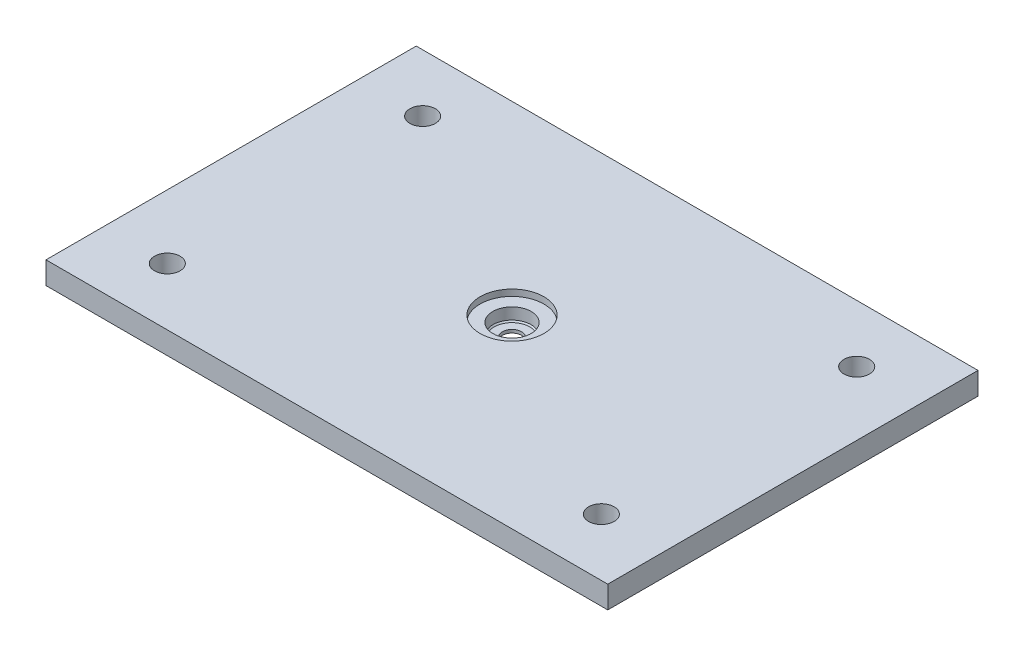
ISO-10303-21;
HEADER;
FILE_DESCRIPTION(('STEP AP214'),'2;1');
FILE_NAME('part.step','',(''),(''),'','','');
FILE_SCHEMA(('AUTOMOTIVE_DESIGN { 1 0 10303 214 1 1 1 1 }'));
ENDSEC;
DATA;
#1=APPLICATION_CONTEXT('core data for automotive mechanical design processes');
#2=APPLICATION_PROTOCOL_DEFINITION('international standard','automotive_design',2000,#1);
#3=PRODUCT_CONTEXT('',#1,'mechanical');
#4=PRODUCT('Part','Part','',(#3));
#5=PRODUCT_RELATED_PRODUCT_CATEGORY('part','',(#4));
#6=PRODUCT_DEFINITION_FORMATION('','',#4);
#7=PRODUCT_DEFINITION_CONTEXT('part definition',#1,'design');
#8=PRODUCT_DEFINITION('design','',#6,#7);
#9=PRODUCT_DEFINITION_SHAPE('','',#8);
#10=(LENGTH_UNIT() NAMED_UNIT(*) SI_UNIT(.MILLI.,.METRE.));
#11=(NAMED_UNIT(*) PLANE_ANGLE_UNIT() SI_UNIT($,.RADIAN.));
#12=(NAMED_UNIT(*) SI_UNIT($,.STERADIAN.) SOLID_ANGLE_UNIT());
#13=UNCERTAINTY_MEASURE_WITH_UNIT(LENGTH_MEASURE(1.E-05),#10,'distance_accuracy_value','');
#14=(GEOMETRIC_REPRESENTATION_CONTEXT(3) GLOBAL_UNCERTAINTY_ASSIGNED_CONTEXT((#13)) GLOBAL_UNIT_ASSIGNED_CONTEXT((#10,
#11,#12)) REPRESENTATION_CONTEXT('',''));
#15=CARTESIAN_POINT('',(0.,0.,0.));
#16=DIRECTION('',(0.,0.,1.));
#17=DIRECTION('',(1.,0.,0.));
#18=AXIS2_PLACEMENT_3D('',#15,#16,#17);
#19=CARTESIAN_POINT('',(440.,35.,-290.));
#20=DIRECTION('',(-1.,0.,0.));
#21=DIRECTION('',(0.,0.,1.));
#22=AXIS2_PLACEMENT_3D('',#19,#20,#21);
#23=PLANE('',#22);
#24=DIRECTION('',(0.,0.,-1.));
#25=VECTOR('',#24,1.);
#26=CARTESIAN_POINT('',(440.,0.,-290.));
#27=LINE('',#26,#25);
#28=CARTESIAN_POINT('',(440.,0.,290.));
#29=VERTEX_POINT('',#28);
#30=CARTESIAN_POINT('',(440.,0.,-290.));
#31=VERTEX_POINT('',#30);
#32=EDGE_CURVE('E103',#29,#31,#27,.T.);
#33=ORIENTED_EDGE('',*,*,#32,.T.);
#34=DIRECTION('',(0.,-1.,0.));
#35=VECTOR('',#34,1.);
#36=CARTESIAN_POINT('',(440.,35.,-290.));
#37=LINE('',#36,#35);
#38=CARTESIAN_POINT('',(440.,35.,-290.));
#39=VERTEX_POINT('',#38);
#40=EDGE_CURVE('E94',#39,#31,#37,.T.);
#41=ORIENTED_EDGE('',*,*,#40,.F.);
#42=DIRECTION('',(0.,0.,-1.));
#43=VECTOR('',#42,1.);
#44=CARTESIAN_POINT('',(440.,35.,-290.));
#45=LINE('',#44,#43);
#46=CARTESIAN_POINT('',(440.,35.,290.));
#47=VERTEX_POINT('',#46);
#48=EDGE_CURVE('E88',#47,#39,#45,.T.);
#49=ORIENTED_EDGE('',*,*,#48,.F.);
#50=DIRECTION('',(0.,-1.,0.));
#51=VECTOR('',#50,1.);
#52=CARTESIAN_POINT('',(440.,35.,290.));
#53=LINE('',#52,#51);
#54=EDGE_CURVE('E99',#47,#29,#53,.T.);
#55=ORIENTED_EDGE('',*,*,#54,.T.);
#56=EDGE_LOOP('',(#33,#41,#49,#55));
#57=FACE_BOUND('',#56,.T.);
#58=ADVANCED_FACE('F33',(#57),#23,.F.);
#59=CARTESIAN_POINT('',(-440.,35.,-290.));
#60=DIRECTION('',(0.,0.,1.));
#61=DIRECTION('',(1.,0.,0.));
#62=AXIS2_PLACEMENT_3D('',#59,#60,#61);
#63=PLANE('',#62);
#64=DIRECTION('',(-1.,0.,0.));
#65=VECTOR('',#64,1.);
#66=CARTESIAN_POINT('',(-440.,0.,-290.));
#67=LINE('',#66,#65);
#68=CARTESIAN_POINT('',(-440.,0.,-290.));
#69=VERTEX_POINT('',#68);
#70=EDGE_CURVE('E93',#31,#69,#67,.T.);
#71=ORIENTED_EDGE('',*,*,#70,.T.);
#72=DIRECTION('',(0.,-1.,0.));
#73=VECTOR('',#72,1.);
#74=CARTESIAN_POINT('',(-440.,35.,-290.));
#75=LINE('',#74,#73);
#76=CARTESIAN_POINT('',(-440.,35.,-290.));
#77=VERTEX_POINT('',#76);
#78=EDGE_CURVE('E91',#77,#69,#75,.T.);
#79=ORIENTED_EDGE('',*,*,#78,.F.);
#80=DIRECTION('',(-1.,0.,0.));
#81=VECTOR('',#80,1.);
#82=CARTESIAN_POINT('',(-440.,35.,-290.));
#83=LINE('',#82,#81);
#84=EDGE_CURVE('E83',#39,#77,#83,.T.);
#85=ORIENTED_EDGE('',*,*,#84,.F.);
#86=ORIENTED_EDGE('',*,*,#40,.T.);
#87=EDGE_LOOP('',(#71,#79,#85,#86));
#88=FACE_BOUND('',#87,.T.);
#89=ADVANCED_FACE('F92',(#88),#63,.F.);
#90=CARTESIAN_POINT('',(-440.,35.,-290.));
#91=DIRECTION('',(1.,0.,0.));
#92=DIRECTION('',(0.,0.,-1.));
#93=AXIS2_PLACEMENT_3D('',#90,#91,#92);
#94=PLANE('',#93);
#95=DIRECTION('',(0.,0.,1.));
#96=VECTOR('',#95,1.);
#97=CARTESIAN_POINT('',(-440.,0.,-290.));
#98=LINE('',#97,#96);
#99=CARTESIAN_POINT('',(-440.,0.,290.));
#100=VERTEX_POINT('',#99);
#101=EDGE_CURVE('E69',#69,#100,#98,.T.);
#102=ORIENTED_EDGE('',*,*,#101,.T.);
#103=DIRECTION('',(0.,-1.,0.));
#104=VECTOR('',#103,1.);
#105=CARTESIAN_POINT('',(-440.,35.,290.));
#106=LINE('',#105,#104);
#107=CARTESIAN_POINT('',(-440.,35.,290.));
#108=VERTEX_POINT('',#107);
#109=EDGE_CURVE('E95',#108,#100,#106,.T.);
#110=ORIENTED_EDGE('',*,*,#109,.F.);
#111=DIRECTION('',(0.,0.,1.));
#112=VECTOR('',#111,1.);
#113=CARTESIAN_POINT('',(-440.,35.,-290.));
#114=LINE('',#113,#112);
#115=EDGE_CURVE('E86',#77,#108,#114,.T.);
#116=ORIENTED_EDGE('',*,*,#115,.F.);
#117=ORIENTED_EDGE('',*,*,#78,.T.);
#118=EDGE_LOOP('',(#102,#110,#116,#117));
#119=FACE_BOUND('',#118,.T.);
#120=ADVANCED_FACE('F97',(#119),#94,.F.);
#121=CARTESIAN_POINT('',(-440.,35.,290.));
#122=DIRECTION('',(0.,0.,-1.));
#123=DIRECTION('',(-1.,0.,0.));
#124=AXIS2_PLACEMENT_3D('',#121,#122,#123);
#125=PLANE('',#124);
#126=DIRECTION('',(1.,0.,0.));
#127=VECTOR('',#126,1.);
#128=CARTESIAN_POINT('',(-440.,0.,290.));
#129=LINE('',#128,#127);
#130=EDGE_CURVE('E75',#100,#29,#129,.T.);
#131=ORIENTED_EDGE('',*,*,#130,.T.);
#132=ORIENTED_EDGE('',*,*,#54,.F.);
#133=DIRECTION('',(1.,0.,0.));
#134=VECTOR('',#133,1.);
#135=CARTESIAN_POINT('',(-440.,35.,290.));
#136=LINE('',#135,#134);
#137=EDGE_CURVE('E52',#108,#47,#136,.T.);
#138=ORIENTED_EDGE('',*,*,#137,.F.);
#139=ORIENTED_EDGE('',*,*,#109,.T.);
#140=EDGE_LOOP('',(#131,#132,#138,#139));
#141=FACE_BOUND('',#140,.T.);
#142=ADVANCED_FACE('F158',(#141),#125,.F.);
#143=CARTESIAN_POINT('',(0.,35.,0.));
#144=DIRECTION('',(0.,1.,0.));
#145=DIRECTION('',(0.,0.,1.));
#146=AXIS2_PLACEMENT_3D('',#143,#144,#145);
#147=PLANE('',#146);
#148=CARTESIAN_POINT('',(-340.,35.,200.));
#149=DIRECTION('',(0.,1.,0.));
#150=DIRECTION('',(0.,0.,-1.));
#151=AXIS2_PLACEMENT_3D('',#148,#149,#150);
#152=CIRCLE('',#151,20.);
#153=CARTESIAN_POINT('',(-340.,35.,180.));
#154=VERTEX_POINT('',#153);
#155=EDGE_CURVE('E135',#154,#154,#152,.T.);
#156=ORIENTED_EDGE('',*,*,#155,.F.);
#157=EDGE_LOOP('',(#156));
#158=FACE_BOUND('',#157,.T.);
#159=CARTESIAN_POINT('',(340.,35.,200.));
#160=DIRECTION('',(0.,1.,0.));
#161=DIRECTION('',(0.,0.,-1.));
#162=AXIS2_PLACEMENT_3D('',#159,#160,#161);
#163=CIRCLE('',#162,20.);
#164=CARTESIAN_POINT('',(340.,35.,180.));
#165=VERTEX_POINT('',#164);
#166=EDGE_CURVE('E125',#165,#165,#163,.T.);
#167=ORIENTED_EDGE('',*,*,#166,.F.);
#168=EDGE_LOOP('',(#167));
#169=FACE_BOUND('',#168,.T.);
#170=CARTESIAN_POINT('',(340.,35.,-200.));
#171=DIRECTION('',(0.,1.,0.));
#172=DIRECTION('',(0.,0.,1.));
#173=AXIS2_PLACEMENT_3D('',#170,#171,#172);
#174=CIRCLE('',#173,20.);
#175=CARTESIAN_POINT('',(340.,35.,-180.));
#176=VERTEX_POINT('',#175);
#177=EDGE_CURVE('E122',#176,#176,#174,.T.);
#178=ORIENTED_EDGE('',*,*,#177,.F.);
#179=EDGE_LOOP('',(#178));
#180=FACE_BOUND('',#179,.T.);
#181=CARTESIAN_POINT('',(-340.,35.,-200.));
#182=DIRECTION('',(0.,1.,0.));
#183=DIRECTION('',(0.,0.,1.));
#184=AXIS2_PLACEMENT_3D('',#181,#182,#183);
#185=CIRCLE('',#184,20.);
#186=CARTESIAN_POINT('',(-340.,35.,-180.));
#187=VERTEX_POINT('',#186);
#188=EDGE_CURVE('E119',#187,#187,#185,.T.);
#189=ORIENTED_EDGE('',*,*,#188,.F.);
#190=EDGE_LOOP('',(#189));
#191=FACE_BOUND('',#190,.T.);
#192=CARTESIAN_POINT('',(0.,35.,0.));
#193=DIRECTION('',(0.,1.,0.));
#194=DIRECTION('',(0.,0.,1.));
#195=AXIS2_PLACEMENT_3D('',#192,#193,#194);
#196=CIRCLE('',#195,50.);
#197=CARTESIAN_POINT('',(0.,35.,50.));
#198=VERTEX_POINT('',#197);
#199=EDGE_CURVE('E148',#198,#198,#196,.T.);
#200=ORIENTED_EDGE('',*,*,#199,.F.);
#201=EDGE_LOOP('',(#200));
#202=FACE_BOUND('',#201,.T.);
#203=ORIENTED_EDGE('',*,*,#48,.T.);
#204=ORIENTED_EDGE('',*,*,#84,.T.);
#205=ORIENTED_EDGE('',*,*,#115,.T.);
#206=ORIENTED_EDGE('',*,*,#137,.T.);
#207=EDGE_LOOP('',(#203,#204,#205,#206));
#208=FACE_BOUND('',#207,.T.);
#209=ADVANCED_FACE('F84',(#158,#169,#180,#191,#202,#208),#147,.T.);
#210=CARTESIAN_POINT('',(0.,0.,0.));
#211=DIRECTION('',(0.,1.,0.));
#212=DIRECTION('',(0.,0.,1.));
#213=AXIS2_PLACEMENT_3D('',#210,#211,#212);
#214=PLANE('',#213);
#215=CARTESIAN_POINT('',(-340.,0.,200.));
#216=DIRECTION('',(0.,1.,0.));
#217=DIRECTION('',(0.,0.,1.));
#218=AXIS2_PLACEMENT_3D('',#215,#216,#217);
#219=CIRCLE('',#218,20.);
#220=CARTESIAN_POINT('',(-340.,0.,220.));
#221=VERTEX_POINT('',#220);
#222=EDGE_CURVE('E37',#221,#221,#219,.T.);
#223=ORIENTED_EDGE('',*,*,#222,.T.);
#224=EDGE_LOOP('',(#223));
#225=FACE_BOUND('',#224,.T.);
#226=CARTESIAN_POINT('',(340.,0.,200.));
#227=DIRECTION('',(0.,1.,0.));
#228=DIRECTION('',(0.,0.,1.));
#229=AXIS2_PLACEMENT_3D('',#226,#227,#228);
#230=CIRCLE('',#229,20.);
#231=CARTESIAN_POINT('',(340.,0.,220.));
#232=VERTEX_POINT('',#231);
#233=EDGE_CURVE('E123',#232,#232,#230,.T.);
#234=ORIENTED_EDGE('',*,*,#233,.T.);
#235=EDGE_LOOP('',(#234));
#236=FACE_BOUND('',#235,.T.);
#237=CARTESIAN_POINT('',(340.,0.,-200.));
#238=DIRECTION('',(0.,1.,0.));
#239=DIRECTION('',(0.,0.,1.));
#240=AXIS2_PLACEMENT_3D('',#237,#238,#239);
#241=CIRCLE('',#240,20.);
#242=CARTESIAN_POINT('',(340.,0.,-180.));
#243=VERTEX_POINT('',#242);
#244=EDGE_CURVE('E120',#243,#243,#241,.T.);
#245=ORIENTED_EDGE('',*,*,#244,.T.);
#246=EDGE_LOOP('',(#245));
#247=FACE_BOUND('',#246,.T.);
#248=CARTESIAN_POINT('',(-340.,0.,-200.));
#249=DIRECTION('',(0.,1.,0.));
#250=DIRECTION('',(0.,0.,1.));
#251=AXIS2_PLACEMENT_3D('',#248,#249,#250);
#252=CIRCLE('',#251,20.);
#253=CARTESIAN_POINT('',(-340.,0.,-180.));
#254=VERTEX_POINT('',#253);
#255=EDGE_CURVE('E115',#254,#254,#252,.T.);
#256=ORIENTED_EDGE('',*,*,#255,.T.);
#257=EDGE_LOOP('',(#256));
#258=FACE_BOUND('',#257,.T.);
#259=CARTESIAN_POINT('',(0.,0.,0.));
#260=DIRECTION('',(0.,1.,0.));
#261=DIRECTION('',(0.,0.,1.));
#262=AXIS2_PLACEMENT_3D('',#259,#260,#261);
#263=CIRCLE('',#262,15.);
#264=CARTESIAN_POINT('',(0.,0.,15.));
#265=VERTEX_POINT('',#264);
#266=EDGE_CURVE('E142',#265,#265,#263,.T.);
#267=ORIENTED_EDGE('',*,*,#266,.T.);
#268=EDGE_LOOP('',(#267));
#269=FACE_BOUND('',#268,.T.);
#270=ORIENTED_EDGE('',*,*,#32,.F.);
#271=ORIENTED_EDGE('',*,*,#130,.F.);
#272=ORIENTED_EDGE('',*,*,#101,.F.);
#273=ORIENTED_EDGE('',*,*,#70,.F.);
#274=EDGE_LOOP('',(#270,#271,#272,#273));
#275=FACE_BOUND('',#274,.T.);
#276=ADVANCED_FACE('F157',(#225,#236,#247,#258,#269,#275),#214,.F.);
#277=CARTESIAN_POINT('',(0.,25.,0.));
#278=DIRECTION('',(0.,1.,0.));
#279=DIRECTION('',(0.,0.,1.));
#280=AXIS2_PLACEMENT_3D('',#277,#278,#279);
#281=CYLINDRICAL_SURFACE('',#280,50.);
#282=CARTESIAN_POINT('',(0.,25.,0.));
#283=DIRECTION('',(0.,1.,0.));
#284=DIRECTION('',(0.,0.,1.));
#285=AXIS2_PLACEMENT_3D('',#282,#283,#284);
#286=CIRCLE('',#285,50.);
#287=CARTESIAN_POINT('',(0.,25.,50.));
#288=VERTEX_POINT('',#287);
#289=EDGE_CURVE('E106',#288,#288,#286,.T.);
#290=ORIENTED_EDGE('',*,*,#289,.F.);
#291=EDGE_LOOP('',(#290));
#292=FACE_BOUND('',#291,.T.);
#293=ORIENTED_EDGE('',*,*,#199,.T.);
#294=EDGE_LOOP('',(#293));
#295=FACE_BOUND('',#294,.T.);
#296=ADVANCED_FACE('F154',(#292,#295),#281,.F.);
#297=CARTESIAN_POINT('',(0.,25.,0.));
#298=DIRECTION('',(0.,1.,0.));
#299=DIRECTION('',(0.,0.,1.));
#300=AXIS2_PLACEMENT_3D('',#297,#298,#299);
#301=PLANE('',#300);
#302=CARTESIAN_POINT('',(0.,25.,0.));
#303=DIRECTION('',(0.,1.,0.));
#304=DIRECTION('',(0.,0.,1.));
#305=AXIS2_PLACEMENT_3D('',#302,#303,#304);
#306=CIRCLE('',#305,30.);
#307=CARTESIAN_POINT('',(0.,25.,30.));
#308=VERTEX_POINT('',#307);
#309=EDGE_CURVE('E145',#308,#308,#306,.T.);
#310=ORIENTED_EDGE('',*,*,#309,.F.);
#311=EDGE_LOOP('',(#310));
#312=FACE_BOUND('',#311,.T.);
#313=ORIENTED_EDGE('',*,*,#289,.T.);
#314=EDGE_LOOP('',(#313));
#315=FACE_BOUND('',#314,.T.);
#316=ADVANCED_FACE('F206',(#312,#315),#301,.T.);
#317=CARTESIAN_POINT('',(0.,5.,0.));
#318=DIRECTION('',(0.,1.,0.));
#319=DIRECTION('',(0.,0.,1.));
#320=AXIS2_PLACEMENT_3D('',#317,#318,#319);
#321=CYLINDRICAL_SURFACE('',#320,30.);
#322=CARTESIAN_POINT('',(0.,7.00000000000033,0.));
#323=DIRECTION('',(0.,1.,0.));
#324=DIRECTION('',(0.,0.,1.));
#325=AXIS2_PLACEMENT_3D('',#322,#323,#324);
#326=CIRCLE('',#325,30.);
#327=CARTESIAN_POINT('',(0.,7.00000000000033,30.));
#328=VERTEX_POINT('',#327);
#329=EDGE_CURVE('E11',#328,#328,#326,.F.);
#330=ORIENTED_EDGE('',*,*,#329,.T.);
#331=EDGE_LOOP('',(#330));
#332=FACE_BOUND('',#331,.T.);
#333=ORIENTED_EDGE('',*,*,#309,.T.);
#334=EDGE_LOOP('',(#333));
#335=FACE_BOUND('',#334,.T.);
#336=ADVANCED_FACE('F212',(#332,#335),#321,.F.);
#337=CARTESIAN_POINT('',(0.,5.,0.));
#338=DIRECTION('',(0.,1.,0.));
#339=DIRECTION('',(0.,0.,1.));
#340=AXIS2_PLACEMENT_3D('',#337,#338,#339);
#341=PLANE('',#340);
#342=CARTESIAN_POINT('',(0.,5.,0.));
#343=DIRECTION('',(0.,1.,0.));
#344=DIRECTION('',(0.,0.,1.));
#345=AXIS2_PLACEMENT_3D('',#342,#343,#344);
#346=CIRCLE('',#345,27.9999999999998);
#347=CARTESIAN_POINT('',(0.,5.,27.9999999999998));
#348=VERTEX_POINT('',#347);
#349=EDGE_CURVE('E43',#348,#348,#346,.T.);
#350=ORIENTED_EDGE('',*,*,#349,.T.);
#351=EDGE_LOOP('',(#350));
#352=FACE_BOUND('',#351,.T.);
#353=CARTESIAN_POINT('',(0.,5.,0.));
#354=DIRECTION('',(0.,1.,0.));
#355=DIRECTION('',(0.,0.,1.));
#356=AXIS2_PLACEMENT_3D('',#353,#354,#355);
#357=CIRCLE('',#356,15.);
#358=CARTESIAN_POINT('',(0.,5.,15.));
#359=VERTEX_POINT('',#358);
#360=EDGE_CURVE('E118',#359,#359,#357,.T.);
#361=ORIENTED_EDGE('',*,*,#360,.F.);
#362=EDGE_LOOP('',(#361));
#363=FACE_BOUND('',#362,.T.);
#364=ADVANCED_FACE('F221',(#352,#363),#341,.T.);
#365=CARTESIAN_POINT('',(0.,-517.,0.));
#366=DIRECTION('',(0.,1.,0.));
#367=DIRECTION('',(0.,0.,1.));
#368=AXIS2_PLACEMENT_3D('',#365,#366,#367);
#369=CYLINDRICAL_SURFACE('',#368,15.);
#370=ORIENTED_EDGE('',*,*,#360,.T.);
#371=EDGE_LOOP('',(#370));
#372=FACE_BOUND('',#371,.T.);
#373=ORIENTED_EDGE('',*,*,#266,.F.);
#374=EDGE_LOOP('',(#373));
#375=FACE_BOUND('',#374,.T.);
#376=ADVANCED_FACE('F229',(#372,#375),#369,.F.);
#377=CARTESIAN_POINT('',(0.,5.,0.));
#378=DIRECTION('',(0.,1.,0.));
#379=DIRECTION('',(0.,0.,1.));
#380=AXIS2_PLACEMENT_3D('',#377,#378,#379);
#381=CONICAL_SURFACE('',#380,27.9999999999998,0.785398163397415);
#382=ORIENTED_EDGE('',*,*,#329,.F.);
#383=EDGE_LOOP('',(#382));
#384=FACE_BOUND('',#383,.T.);
#385=ORIENTED_EDGE('',*,*,#349,.F.);
#386=EDGE_LOOP('',(#385));
#387=FACE_BOUND('',#386,.T.);
#388=ADVANCED_FACE('F35',(#384,#387),#381,.F.);
#389=CARTESIAN_POINT('',(-340.,-415.,-200.));
#390=DIRECTION('',(0.,1.,0.));
#391=DIRECTION('',(0.,0.,1.));
#392=AXIS2_PLACEMENT_3D('',#389,#390,#391);
#393=CYLINDRICAL_SURFACE('',#392,20.);
#394=ORIENTED_EDGE('',*,*,#188,.T.);
#395=EDGE_LOOP('',(#394));
#396=FACE_BOUND('',#395,.T.);
#397=ORIENTED_EDGE('',*,*,#255,.F.);
#398=EDGE_LOOP('',(#397));
#399=FACE_BOUND('',#398,.T.);
#400=ADVANCED_FACE('F242',(#396,#399),#393,.F.);
#401=CARTESIAN_POINT('',(340.,-415.,-200.));
#402=DIRECTION('',(0.,1.,0.));
#403=DIRECTION('',(0.,0.,1.));
#404=AXIS2_PLACEMENT_3D('',#401,#402,#403);
#405=CYLINDRICAL_SURFACE('',#404,20.);
#406=ORIENTED_EDGE('',*,*,#177,.T.);
#407=EDGE_LOOP('',(#406));
#408=FACE_BOUND('',#407,.T.);
#409=ORIENTED_EDGE('',*,*,#244,.F.);
#410=EDGE_LOOP('',(#409));
#411=FACE_BOUND('',#410,.T.);
#412=ADVANCED_FACE('F248',(#408,#411),#405,.F.);
#413=CARTESIAN_POINT('',(340.,-415.,200.));
#414=DIRECTION('',(0.,1.,0.));
#415=DIRECTION('',(0.,0.,1.));
#416=AXIS2_PLACEMENT_3D('',#413,#414,#415);
#417=CYLINDRICAL_SURFACE('',#416,20.);
#418=ORIENTED_EDGE('',*,*,#166,.T.);
#419=EDGE_LOOP('',(#418));
#420=FACE_BOUND('',#419,.T.);
#421=ORIENTED_EDGE('',*,*,#233,.F.);
#422=EDGE_LOOP('',(#421));
#423=FACE_BOUND('',#422,.T.);
#424=ADVANCED_FACE('F256',(#420,#423),#417,.F.);
#425=CARTESIAN_POINT('',(-340.,-415.,200.));
#426=DIRECTION('',(0.,1.,0.));
#427=DIRECTION('',(0.,0.,1.));
#428=AXIS2_PLACEMENT_3D('',#425,#426,#427);
#429=CYLINDRICAL_SURFACE('',#428,20.);
#430=ORIENTED_EDGE('',*,*,#155,.T.);
#431=EDGE_LOOP('',(#430));
#432=FACE_BOUND('',#431,.T.);
#433=ORIENTED_EDGE('',*,*,#222,.F.);
#434=EDGE_LOOP('',(#433));
#435=FACE_BOUND('',#434,.T.);
#436=ADVANCED_FACE('F264',(#432,#435),#429,.F.);
#437=CLOSED_SHELL('',(#58,#89,#120,#142,#209,#276,#296,#316,#336,#364,#376,#388,#400,#412,#424,#436));
#438=MANIFOLD_SOLID_BREP('B2',#437);
#439=ADVANCED_BREP_SHAPE_REPRESENTATION('',(#18,#438),#14);
#440=SHAPE_DEFINITION_REPRESENTATION(#9,#439);
ENDSEC;
END-ISO-10303-21;
